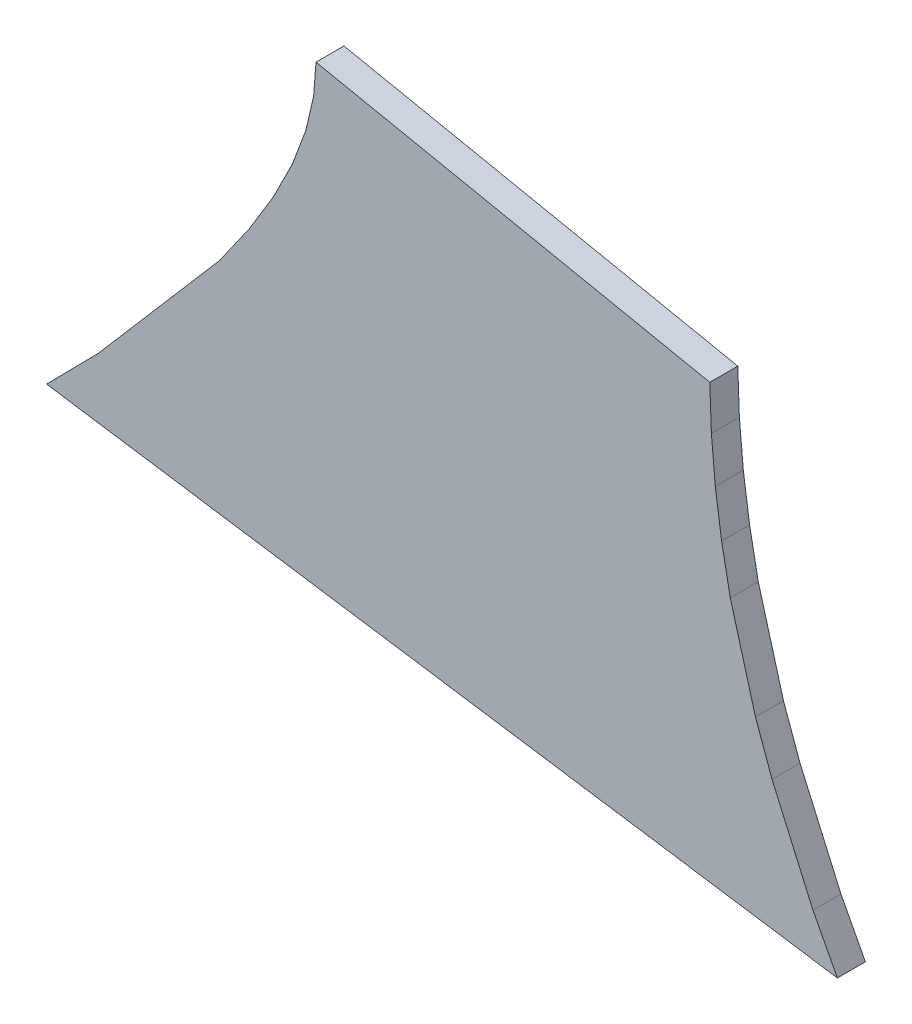
ISO-10303-21;
HEADER;
FILE_DESCRIPTION(('STEP AP214'),'2;1');
FILE_NAME('part.step','',(''),(''),'','','');
FILE_SCHEMA(('AUTOMOTIVE_DESIGN { 1 0 10303 214 1 1 1 1 }'));
ENDSEC;
DATA;
#1=APPLICATION_CONTEXT('core data for automotive mechanical design processes');
#2=APPLICATION_PROTOCOL_DEFINITION('international standard','automotive_design',2000,#1);
#3=PRODUCT_CONTEXT('',#1,'mechanical');
#4=PRODUCT('Part','Part','',(#3));
#5=PRODUCT_RELATED_PRODUCT_CATEGORY('part','',(#4));
#6=PRODUCT_DEFINITION_FORMATION('','',#4);
#7=PRODUCT_DEFINITION_CONTEXT('part definition',#1,'design');
#8=PRODUCT_DEFINITION('design','',#6,#7);
#9=PRODUCT_DEFINITION_SHAPE('','',#8);
#10=(LENGTH_UNIT() NAMED_UNIT(*) SI_UNIT(.MILLI.,.METRE.));
#11=(NAMED_UNIT(*) PLANE_ANGLE_UNIT() SI_UNIT($,.RADIAN.));
#12=(NAMED_UNIT(*) SI_UNIT($,.STERADIAN.) SOLID_ANGLE_UNIT());
#13=UNCERTAINTY_MEASURE_WITH_UNIT(LENGTH_MEASURE(1.E-05),#10,'distance_accuracy_value','');
#14=(GEOMETRIC_REPRESENTATION_CONTEXT(3) GLOBAL_UNCERTAINTY_ASSIGNED_CONTEXT((#13)) GLOBAL_UNIT_ASSIGNED_CONTEXT((#10,
#11,#12)) REPRESENTATION_CONTEXT('',''));
#15=CARTESIAN_POINT('',(0.,0.,0.));
#16=DIRECTION('',(0.,0.,1.));
#17=DIRECTION('',(1.,0.,0.));
#18=AXIS2_PLACEMENT_3D('',#15,#16,#17);
#19=CARTESIAN_POINT('',(87.2969970703125,109.977996826172,0.));
#20=DIRECTION('',(0.997056780120677,-0.0766666629989094,0.));
#21=DIRECTION('',(-0.0766666629989094,-0.997056780120677,0.));
#22=AXIS2_PLACEMENT_3D('',#19,#20,#21);
#23=PLANE('',#22);
#24=DIRECTION('',(-0.0766666629989094,-0.997056780120677,0.));
#25=VECTOR('',#24,1.);
#26=CARTESIAN_POINT('',(87.2969970703125,109.977996826172,0.03556));
#27=LINE('',#26,#25);
#28=CARTESIAN_POINT('',(87.2969970703125,109.977996826172,0.03556));
#29=VERTEX_POINT('',#28);
#30=CARTESIAN_POINT('',(87.2939987182617,109.939002990723,0.03556));
#31=VERTEX_POINT('',#30);
#32=EDGE_CURVE('E11',#29,#31,#27,.T.);
#33=ORIENTED_EDGE('',*,*,#32,.F.);
#34=DIRECTION('',(0.,0.,1.));
#35=VECTOR('',#34,1.);
#36=CARTESIAN_POINT('',(87.2969970703125,109.977996826172,0.));
#37=LINE('',#36,#35);
#38=CARTESIAN_POINT('',(87.2969970703125,109.977996826172,0.));
#39=VERTEX_POINT('',#38);
#40=EDGE_CURVE('E24',#39,#29,#37,.T.);
#41=ORIENTED_EDGE('',*,*,#40,.F.);
#42=DIRECTION('',(-0.0766666629989094,-0.997056780120677,0.));
#43=VECTOR('',#42,1.);
#44=CARTESIAN_POINT('',(87.2969970703125,109.977996826172,0.));
#45=LINE('',#44,#43);
#46=CARTESIAN_POINT('',(87.2939987182617,109.939002990723,0.));
#47=VERTEX_POINT('',#46);
#48=EDGE_CURVE('E160',#39,#47,#45,.T.);
#49=ORIENTED_EDGE('',*,*,#48,.T.);
#50=DIRECTION('',(0.,0.,1.));
#51=VECTOR('',#50,1.);
#52=CARTESIAN_POINT('',(87.2939987182617,109.939002990723,0.));
#53=LINE('',#52,#51);
#54=EDGE_CURVE('E37',#47,#31,#53,.T.);
#55=ORIENTED_EDGE('',*,*,#54,.T.);
#56=EDGE_LOOP('',(#33,#41,#49,#55));
#57=FACE_BOUND('',#56,.T.);
#58=ADVANCED_FACE('F17',(#57),#23,.F.);
#59=CARTESIAN_POINT('',(87.2939987182617,109.939002990723,0.));
#60=DIRECTION('',(0.97399649873471,-0.226563060653159,0.));
#61=DIRECTION('',(-0.226563060653159,-0.97399649873471,0.));
#62=AXIS2_PLACEMENT_3D('',#59,#60,#61);
#63=PLANE('',#62);
#64=DIRECTION('',(-0.226563060653159,-0.97399649873471,0.));
#65=VECTOR('',#64,1.);
#66=CARTESIAN_POINT('',(87.2939987182617,109.939002990723,0.03556));
#67=LINE('',#66,#65);
#68=CARTESIAN_POINT('',(87.2839965820313,109.896003723144,0.03556));
#69=VERTEX_POINT('',#68);
#70=EDGE_CURVE('E280',#31,#69,#67,.T.);
#71=ORIENTED_EDGE('',*,*,#70,.F.);
#72=ORIENTED_EDGE('',*,*,#54,.F.);
#73=DIRECTION('',(-0.226563060653159,-0.97399649873471,0.));
#74=VECTOR('',#73,1.);
#75=CARTESIAN_POINT('',(87.2939987182617,109.939002990723,0.));
#76=LINE('',#75,#74);
#77=CARTESIAN_POINT('',(87.2839965820313,109.896003723144,0.));
#78=VERTEX_POINT('',#77);
#79=EDGE_CURVE('E277',#47,#78,#76,.T.);
#80=ORIENTED_EDGE('',*,*,#79,.T.);
#81=DIRECTION('',(0.,0.,1.));
#82=VECTOR('',#81,1.);
#83=CARTESIAN_POINT('',(87.2839965820313,109.896003723144,0.));
#84=LINE('',#83,#82);
#85=EDGE_CURVE('E275',#78,#69,#84,.T.);
#86=ORIENTED_EDGE('',*,*,#85,.T.);
#87=EDGE_LOOP('',(#71,#72,#80,#86));
#88=FACE_BOUND('',#87,.T.);
#89=ADVANCED_FACE('F288',(#88),#63,.F.);
#90=CARTESIAN_POINT('',(87.2839965820313,109.896003723144,0.));
#91=DIRECTION('',(0.935498887490532,-0.353329635756722,0.));
#92=DIRECTION('',(-0.353329635756722,-0.935498887490532,0.));
#93=AXIS2_PLACEMENT_3D('',#90,#91,#92);
#94=PLANE('',#93);
#95=DIRECTION('',(-0.353329635756722,-0.935498887490532,0.));
#96=VECTOR('',#95,1.);
#97=CARTESIAN_POINT('',(87.2839965820313,109.896003723144,0.03556));
#98=LINE('',#97,#96);
#99=CARTESIAN_POINT('',(87.2669982910156,109.850997924805,0.03556));
#100=VERTEX_POINT('',#99);
#101=EDGE_CURVE('E272',#69,#100,#98,.T.);
#102=ORIENTED_EDGE('',*,*,#101,.F.);
#103=ORIENTED_EDGE('',*,*,#85,.F.);
#104=DIRECTION('',(-0.353329635756722,-0.935498887490532,0.));
#105=VECTOR('',#104,1.);
#106=CARTESIAN_POINT('',(87.2839965820313,109.896003723144,0.));
#107=LINE('',#106,#105);
#108=CARTESIAN_POINT('',(87.2669982910156,109.850997924805,0.));
#109=VERTEX_POINT('',#108);
#110=EDGE_CURVE('E269',#78,#109,#107,.T.);
#111=ORIENTED_EDGE('',*,*,#110,.T.);
#112=DIRECTION('',(0.,0.,1.));
#113=VECTOR('',#112,1.);
#114=CARTESIAN_POINT('',(87.2669982910156,109.850997924805,0.));
#115=LINE('',#114,#113);
#116=EDGE_CURVE('E267',#109,#100,#115,.T.);
#117=ORIENTED_EDGE('',*,*,#116,.T.);
#118=EDGE_LOOP('',(#102,#103,#111,#117));
#119=FACE_BOUND('',#118,.T.);
#120=ADVANCED_FACE('F294',(#119),#94,.F.);
#121=CARTESIAN_POINT('',(87.2669982910156,109.850997924805,0.));
#122=DIRECTION('',(0.894398754960443,-0.44727046305922,0.));
#123=DIRECTION('',(-0.44727046305922,-0.894398754960443,0.));
#124=AXIS2_PLACEMENT_3D('',#121,#122,#123);
#125=PLANE('',#124);
#126=DIRECTION('',(-0.44727046305922,-0.894398754960443,0.));
#127=VECTOR('',#126,1.);
#128=CARTESIAN_POINT('',(87.2669982910156,109.850997924805,0.03556));
#129=LINE('',#128,#127);
#130=CARTESIAN_POINT('',(87.2429962158203,109.803001403809,0.03556));
#131=VERTEX_POINT('',#130);
#132=EDGE_CURVE('E264',#100,#131,#129,.T.);
#133=ORIENTED_EDGE('',*,*,#132,.F.);
#134=ORIENTED_EDGE('',*,*,#116,.F.);
#135=DIRECTION('',(-0.44727046305922,-0.894398754960443,0.));
#136=VECTOR('',#135,1.);
#137=CARTESIAN_POINT('',(87.2669982910156,109.850997924805,0.));
#138=LINE('',#137,#136);
#139=CARTESIAN_POINT('',(87.2429962158203,109.803001403809,0.));
#140=VERTEX_POINT('',#139);
#141=EDGE_CURVE('E261',#109,#140,#138,.T.);
#142=ORIENTED_EDGE('',*,*,#141,.T.);
#143=DIRECTION('',(0.,0.,1.));
#144=VECTOR('',#143,1.);
#145=CARTESIAN_POINT('',(87.2429962158203,109.803001403809,0.));
#146=LINE('',#145,#144);
#147=EDGE_CURVE('E259',#140,#131,#146,.T.);
#148=ORIENTED_EDGE('',*,*,#147,.T.);
#149=EDGE_LOOP('',(#133,#134,#142,#148));
#150=FACE_BOUND('',#149,.T.);
#151=ADVANCED_FACE('F296',(#150),#125,.F.);
#152=CARTESIAN_POINT('',(87.2429962158203,109.803001403809,0.));
#153=DIRECTION('',(0.854546415635616,-0.519375031672028,0.));
#154=DIRECTION('',(-0.519375031672028,-0.854546415635616,0.));
#155=AXIS2_PLACEMENT_3D('',#152,#153,#154);
#156=PLANE('',#155);
#157=DIRECTION('',(-0.519375031672028,-0.854546415635616,0.));
#158=VECTOR('',#157,1.);
#159=CARTESIAN_POINT('',(87.2429962158203,109.803001403809,0.03556));
#160=LINE('',#159,#158);
#161=CARTESIAN_POINT('',(87.2119979858398,109.751998901367,0.03556));
#162=VERTEX_POINT('',#161);
#163=EDGE_CURVE('E256',#131,#162,#160,.T.);
#164=ORIENTED_EDGE('',*,*,#163,.F.);
#165=ORIENTED_EDGE('',*,*,#147,.F.);
#166=DIRECTION('',(-0.519375031672028,-0.854546415635616,0.));
#167=VECTOR('',#166,1.);
#168=CARTESIAN_POINT('',(87.2429962158203,109.803001403809,0.));
#169=LINE('',#168,#167);
#170=CARTESIAN_POINT('',(87.2119979858398,109.751998901367,0.));
#171=VERTEX_POINT('',#170);
#172=EDGE_CURVE('E253',#140,#171,#169,.T.);
#173=ORIENTED_EDGE('',*,*,#172,.T.);
#174=DIRECTION('',(0.,0.,1.));
#175=VECTOR('',#174,1.);
#176=CARTESIAN_POINT('',(87.2119979858398,109.751998901367,0.));
#177=LINE('',#176,#175);
#178=EDGE_CURVE('E251',#171,#162,#177,.T.);
#179=ORIENTED_EDGE('',*,*,#178,.T.);
#180=EDGE_LOOP('',(#164,#165,#173,#179));
#181=FACE_BOUND('',#180,.T.);
#182=ADVANCED_FACE('F301',(#181),#156,.F.);
#183=CARTESIAN_POINT('',(87.2119979858398,109.751998901367,0.));
#184=DIRECTION('',(0.817850728051964,-0.575430435956313,0.));
#185=DIRECTION('',(-0.575430435956313,-0.817850728051964,0.));
#186=AXIS2_PLACEMENT_3D('',#183,#184,#185);
#187=PLANE('',#186);
#188=DIRECTION('',(-0.575430435956313,-0.817850728051964,0.));
#189=VECTOR('',#188,1.);
#190=CARTESIAN_POINT('',(87.2119979858398,109.751998901367,0.03556));
#191=LINE('',#190,#189);
#192=CARTESIAN_POINT('',(87.1740036010742,109.697998046875,0.03556));
#193=VERTEX_POINT('',#192);
#194=EDGE_CURVE('E248',#162,#193,#191,.T.);
#195=ORIENTED_EDGE('',*,*,#194,.F.);
#196=ORIENTED_EDGE('',*,*,#178,.F.);
#197=DIRECTION('',(-0.575430435956313,-0.817850728051964,0.));
#198=VECTOR('',#197,1.);
#199=CARTESIAN_POINT('',(87.2119979858398,109.751998901367,0.));
#200=LINE('',#199,#198);
#201=CARTESIAN_POINT('',(87.1740036010742,109.697998046875,0.));
#202=VERTEX_POINT('',#201);
#203=EDGE_CURVE('E245',#171,#202,#200,.T.);
#204=ORIENTED_EDGE('',*,*,#203,.T.);
#205=DIRECTION('',(0.,0.,1.));
#206=VECTOR('',#205,1.);
#207=CARTESIAN_POINT('',(87.1740036010742,109.697998046875,0.));
#208=LINE('',#207,#206);
#209=EDGE_CURVE('E243',#202,#193,#208,.T.);
#210=ORIENTED_EDGE('',*,*,#209,.T.);
#211=EDGE_LOOP('',(#195,#196,#204,#210));
#212=FACE_BOUND('',#211,.T.);
#213=ADVANCED_FACE('F304',(#212),#187,.F.);
#214=CARTESIAN_POINT('',(87.1740036010742,109.697998046875,0.));
#215=DIRECTION('',(0.758046535640033,-0.652200467497643,0.));
#216=DIRECTION('',(-0.652200467497643,-0.758046535640033,0.));
#217=AXIS2_PLACEMENT_3D('',#214,#215,#216);
#218=PLANE('',#217);
#219=DIRECTION('',(-0.652200467497643,-0.758046535640033,0.));
#220=VECTOR('',#219,1.);
#221=CARTESIAN_POINT('',(87.1740036010742,109.697998046875,0.03556));
#222=LINE('',#221,#220);
#223=CARTESIAN_POINT('',(87.0199966430664,109.518997192383,0.03556));
#224=VERTEX_POINT('',#223);
#225=EDGE_CURVE('E240',#193,#224,#222,.T.);
#226=ORIENTED_EDGE('',*,*,#225,.F.);
#227=ORIENTED_EDGE('',*,*,#209,.F.);
#228=DIRECTION('',(-0.652200467497643,-0.758046535640033,0.));
#229=VECTOR('',#228,1.);
#230=CARTESIAN_POINT('',(87.1740036010742,109.697998046875,0.));
#231=LINE('',#230,#229);
#232=CARTESIAN_POINT('',(87.0199966430664,109.518997192383,0.));
#233=VERTEX_POINT('',#232);
#234=EDGE_CURVE('E237',#202,#233,#231,.T.);
#235=ORIENTED_EDGE('',*,*,#234,.T.);
#236=DIRECTION('',(0.,0.,1.));
#237=VECTOR('',#236,1.);
#238=CARTESIAN_POINT('',(87.0199966430664,109.518997192383,0.));
#239=LINE('',#238,#237);
#240=EDGE_CURVE('E235',#233,#224,#239,.T.);
#241=ORIENTED_EDGE('',*,*,#240,.T.);
#242=EDGE_LOOP('',(#226,#227,#235,#241));
#243=FACE_BOUND('',#242,.T.);
#244=ADVANCED_FACE('F309',(#243),#218,.F.);
#245=CARTESIAN_POINT('',(87.0199966430664,109.518997192383,0.));
#246=DIRECTION('',(0.712481288663156,-0.701691109609413,0.));
#247=DIRECTION('',(-0.701691109609413,-0.712481288663156,0.));
#248=AXIS2_PLACEMENT_3D('',#245,#246,#247);
#249=PLANE('',#248);
#250=DIRECTION('',(-0.701691109609413,-0.712481288663156,0.));
#251=VECTOR('',#250,1.);
#252=CARTESIAN_POINT('',(87.0199966430664,109.518997192383,0.03556));
#253=LINE('',#252,#251);
#254=CARTESIAN_POINT('',(86.9550018310547,109.453002929688,0.03556));
#255=VERTEX_POINT('',#254);
#256=EDGE_CURVE('E232',#224,#255,#253,.T.);
#257=ORIENTED_EDGE('',*,*,#256,.F.);
#258=ORIENTED_EDGE('',*,*,#240,.F.);
#259=DIRECTION('',(-0.701691109609413,-0.712481288663156,0.));
#260=VECTOR('',#259,1.);
#261=CARTESIAN_POINT('',(87.0199966430664,109.518997192383,0.));
#262=LINE('',#261,#260);
#263=CARTESIAN_POINT('',(86.9550018310547,109.453002929688,0.));
#264=VERTEX_POINT('',#263);
#265=EDGE_CURVE('E229',#233,#264,#262,.T.);
#266=ORIENTED_EDGE('',*,*,#265,.T.);
#267=DIRECTION('',(0.,0.,1.));
#268=VECTOR('',#267,1.);
#269=CARTESIAN_POINT('',(86.9550018310547,109.453002929688,0.));
#270=LINE('',#269,#268);
#271=EDGE_CURVE('E227',#264,#255,#270,.T.);
#272=ORIENTED_EDGE('',*,*,#271,.T.);
#273=EDGE_LOOP('',(#257,#258,#266,#272));
#274=FACE_BOUND('',#273,.T.);
#275=ADVANCED_FACE('F312',(#274),#249,.F.);
#276=CARTESIAN_POINT('',(86.9550018310547,109.453002929688,0.));
#277=DIRECTION('',(0.148727006644052,0.98887829255915,0.));
#278=DIRECTION('',(0.98887829255915,-0.148727006644052,0.));
#279=AXIS2_PLACEMENT_3D('',#276,#277,#278);
#280=PLANE('',#279);
#281=DIRECTION('',(0.98887829255915,-0.148727006644052,0.));
#282=VECTOR('',#281,1.);
#283=CARTESIAN_POINT('',(86.9550018310547,109.453002929688,0.03556));
#284=LINE('',#283,#282);
#285=CARTESIAN_POINT('',(87.9589996337891,109.302001953125,0.03556));
#286=VERTEX_POINT('',#285);
#287=EDGE_CURVE('E224',#255,#286,#284,.T.);
#288=ORIENTED_EDGE('',*,*,#287,.F.);
#289=ORIENTED_EDGE('',*,*,#271,.F.);
#290=DIRECTION('',(0.98887829255915,-0.148727006644052,0.));
#291=VECTOR('',#290,1.);
#292=CARTESIAN_POINT('',(86.9550018310547,109.453002929688,0.));
#293=LINE('',#292,#291);
#294=CARTESIAN_POINT('',(87.9589996337891,109.302001953125,0.));
#295=VERTEX_POINT('',#294);
#296=EDGE_CURVE('E221',#264,#295,#293,.T.);
#297=ORIENTED_EDGE('',*,*,#296,.T.);
#298=DIRECTION('',(0.,0.,1.));
#299=VECTOR('',#298,1.);
#300=CARTESIAN_POINT('',(87.9589996337891,109.302001953125,0.));
#301=LINE('',#300,#299);
#302=EDGE_CURVE('E219',#295,#286,#301,.T.);
#303=ORIENTED_EDGE('',*,*,#302,.T.);
#304=EDGE_LOOP('',(#288,#289,#297,#303));
#305=FACE_BOUND('',#304,.T.);
#306=ADVANCED_FACE('F317',(#305),#280,.F.);
#307=CARTESIAN_POINT('',(87.9589996337891,109.302001953125,0.));
#308=DIRECTION('',(-0.885248268877242,-0.465118804661611,0.));
#309=DIRECTION('',(-0.465118804661611,0.885248268877242,0.));
#310=AXIS2_PLACEMENT_3D('',#307,#308,#309);
#311=PLANE('',#310);
#312=DIRECTION('',(-0.465118804661611,0.885248268877242,0.));
#313=VECTOR('',#312,1.);
#314=CARTESIAN_POINT('',(87.9589996337891,109.302001953125,0.03556));
#315=LINE('',#314,#313);
#316=CARTESIAN_POINT('',(87.9280014038086,109.361000061035,0.03556));
#317=VERTEX_POINT('',#316);
#318=EDGE_CURVE('E216',#286,#317,#315,.T.);
#319=ORIENTED_EDGE('',*,*,#318,.F.);
#320=ORIENTED_EDGE('',*,*,#302,.F.);
#321=DIRECTION('',(-0.465118804661611,0.885248268877242,0.));
#322=VECTOR('',#321,1.);
#323=CARTESIAN_POINT('',(87.9589996337891,109.302001953125,0.));
#324=LINE('',#323,#322);
#325=CARTESIAN_POINT('',(87.9280014038086,109.361000061035,0.));
#326=VERTEX_POINT('',#325);
#327=EDGE_CURVE('E213',#295,#326,#324,.T.);
#328=ORIENTED_EDGE('',*,*,#327,.T.);
#329=DIRECTION('',(0.,0.,1.));
#330=VECTOR('',#329,1.);
#331=CARTESIAN_POINT('',(87.9280014038086,109.361000061035,0.));
#332=LINE('',#331,#330);
#333=EDGE_CURVE('E211',#326,#317,#332,.T.);
#334=ORIENTED_EDGE('',*,*,#333,.T.);
#335=EDGE_LOOP('',(#319,#320,#328,#334));
#336=FACE_BOUND('',#335,.T.);
#337=ADVANCED_FACE('F320',(#336),#311,.F.);
#338=CARTESIAN_POINT('',(87.9280014038086,109.361000061035,0.));
#339=DIRECTION('',(-0.915075824077826,-0.403281832207065,0.));
#340=DIRECTION('',(-0.403281832207065,0.915075824077826,0.));
#341=AXIS2_PLACEMENT_3D('',#338,#339,#340);
#342=PLANE('',#341);
#343=DIRECTION('',(-0.403281832207065,0.915075824077826,0.));
#344=VECTOR('',#343,1.);
#345=CARTESIAN_POINT('',(87.9280014038086,109.361000061035,0.03556));
#346=LINE('',#345,#344);
#347=CARTESIAN_POINT('',(87.8759994506836,109.478996276855,0.03556));
#348=VERTEX_POINT('',#347);
#349=EDGE_CURVE('E208',#317,#348,#346,.T.);
#350=ORIENTED_EDGE('',*,*,#349,.F.);
#351=ORIENTED_EDGE('',*,*,#333,.F.);
#352=DIRECTION('',(-0.403281832207065,0.915075824077826,0.));
#353=VECTOR('',#352,1.);
#354=CARTESIAN_POINT('',(87.9280014038086,109.361000061035,0.));
#355=LINE('',#354,#353);
#356=CARTESIAN_POINT('',(87.8759994506836,109.478996276855,0.));
#357=VERTEX_POINT('',#356);
#358=EDGE_CURVE('E205',#326,#357,#355,.T.);
#359=ORIENTED_EDGE('',*,*,#358,.T.);
#360=DIRECTION('',(0.,0.,1.));
#361=VECTOR('',#360,1.);
#362=CARTESIAN_POINT('',(87.8759994506836,109.478996276855,0.));
#363=LINE('',#362,#361);
#364=EDGE_CURVE('E203',#357,#348,#363,.T.);
#365=ORIENTED_EDGE('',*,*,#364,.T.);
#366=EDGE_LOOP('',(#350,#351,#359,#365));
#367=FACE_BOUND('',#366,.T.);
#368=ADVANCED_FACE('F325',(#367),#342,.F.);
#369=CARTESIAN_POINT('',(87.8759994506836,109.478996276855,0.));
#370=DIRECTION('',(-0.940297926418306,-0.340352478429985,0.));
#371=DIRECTION('',(-0.340352478429985,0.940297926418306,0.));
#372=AXIS2_PLACEMENT_3D('',#369,#370,#371);
#373=PLANE('',#372);
#374=DIRECTION('',(-0.340352478429985,0.940297926418306,0.));
#375=VECTOR('',#374,1.);
#376=CARTESIAN_POINT('',(87.8759994506836,109.478996276855,0.03556));
#377=LINE('',#376,#375);
#378=CARTESIAN_POINT('',(87.8550033569336,109.537002563477,0.03556));
#379=VERTEX_POINT('',#378);
#380=EDGE_CURVE('E200',#348,#379,#377,.T.);
#381=ORIENTED_EDGE('',*,*,#380,.F.);
#382=ORIENTED_EDGE('',*,*,#364,.F.);
#383=DIRECTION('',(-0.340352478429985,0.940297926418306,0.));
#384=VECTOR('',#383,1.);
#385=CARTESIAN_POINT('',(87.8759994506836,109.478996276855,0.));
#386=LINE('',#385,#384);
#387=CARTESIAN_POINT('',(87.8550033569336,109.537002563477,0.));
#388=VERTEX_POINT('',#387);
#389=EDGE_CURVE('E197',#357,#388,#386,.T.);
#390=ORIENTED_EDGE('',*,*,#389,.T.);
#391=DIRECTION('',(0.,0.,1.));
#392=VECTOR('',#391,1.);
#393=CARTESIAN_POINT('',(87.8550033569336,109.537002563477,0.));
#394=LINE('',#393,#392);
#395=EDGE_CURVE('E195',#388,#379,#394,.T.);
#396=ORIENTED_EDGE('',*,*,#395,.T.);
#397=EDGE_LOOP('',(#381,#382,#390,#396));
#398=FACE_BOUND('',#397,.T.);
#399=ADVANCED_FACE('F328',(#398),#373,.F.);
#400=CARTESIAN_POINT('',(87.8550033569336,109.537002563477,0.));
#401=DIRECTION('',(-0.963385017152072,-0.268121816954351,0.));
#402=DIRECTION('',(-0.268121816954351,0.963385017152072,0.));
#403=AXIS2_PLACEMENT_3D('',#400,#401,#402);
#404=PLANE('',#403);
#405=DIRECTION('',(-0.268121816954351,0.963385017152072,0.));
#406=VECTOR('',#405,1.);
#407=CARTESIAN_POINT('',(87.8550033569336,109.537002563477,0.03556));
#408=LINE('',#407,#406);
#409=CARTESIAN_POINT('',(87.822998046875,109.652000427246,0.03556));
#410=VERTEX_POINT('',#409);
#411=EDGE_CURVE('E192',#379,#410,#408,.T.);
#412=ORIENTED_EDGE('',*,*,#411,.F.);
#413=ORIENTED_EDGE('',*,*,#395,.F.);
#414=DIRECTION('',(-0.268121816954351,0.963385017152072,0.));
#415=VECTOR('',#414,1.);
#416=CARTESIAN_POINT('',(87.8550033569336,109.537002563477,0.));
#417=LINE('',#416,#415);
#418=CARTESIAN_POINT('',(87.822998046875,109.652000427246,0.));
#419=VERTEX_POINT('',#418);
#420=EDGE_CURVE('E189',#388,#419,#417,.T.);
#421=ORIENTED_EDGE('',*,*,#420,.T.);
#422=DIRECTION('',(0.,0.,1.));
#423=VECTOR('',#422,1.);
#424=CARTESIAN_POINT('',(87.822998046875,109.652000427246,0.));
#425=LINE('',#424,#423);
#426=EDGE_CURVE('E187',#419,#410,#425,.T.);
#427=ORIENTED_EDGE('',*,*,#426,.T.);
#428=EDGE_LOOP('',(#412,#413,#421,#427));
#429=FACE_BOUND('',#428,.T.);
#430=ADVANCED_FACE('F333',(#429),#404,.F.);
#431=CARTESIAN_POINT('',(87.822998046875,109.652000427246,0.));
#432=DIRECTION('',(-0.981877794410834,-0.189515162567317,0.));
#433=DIRECTION('',(-0.189515162567317,0.981877794410834,0.));
#434=AXIS2_PLACEMENT_3D('',#431,#432,#433);
#435=PLANE('',#434);
#436=DIRECTION('',(-0.189515162567317,0.981877794410834,0.));
#437=VECTOR('',#436,1.);
#438=CARTESIAN_POINT('',(87.822998046875,109.652000427246,0.03556));
#439=LINE('',#438,#437);
#440=CARTESIAN_POINT('',(87.8119964599609,109.708999633789,0.03556));
#441=VERTEX_POINT('',#440);
#442=EDGE_CURVE('E184',#410,#441,#439,.T.);
#443=ORIENTED_EDGE('',*,*,#442,.F.);
#444=ORIENTED_EDGE('',*,*,#426,.F.);
#445=DIRECTION('',(-0.189515162567317,0.981877794410834,0.));
#446=VECTOR('',#445,1.);
#447=CARTESIAN_POINT('',(87.822998046875,109.652000427246,0.));
#448=LINE('',#447,#446);
#449=CARTESIAN_POINT('',(87.8119964599609,109.708999633789,0.));
#450=VERTEX_POINT('',#449);
#451=EDGE_CURVE('E181',#419,#450,#448,.T.);
#452=ORIENTED_EDGE('',*,*,#451,.T.);
#453=DIRECTION('',(0.,0.,1.));
#454=VECTOR('',#453,1.);
#455=CARTESIAN_POINT('',(87.8119964599609,109.708999633789,0.));
#456=LINE('',#455,#454);
#457=EDGE_CURVE('E179',#450,#441,#456,.T.);
#458=ORIENTED_EDGE('',*,*,#457,.T.);
#459=EDGE_LOOP('',(#443,#444,#452,#458));
#460=FACE_BOUND('',#459,.T.);
#461=ADVANCED_FACE('F336',(#460),#435,.F.);
#462=CARTESIAN_POINT('',(87.8119964599609,109.708999633789,0.));
#463=DIRECTION('',(-0.989960280537772,-0.141345827520925,0.));
#464=DIRECTION('',(-0.141345827520925,0.989960280537772,0.));
#465=AXIS2_PLACEMENT_3D('',#462,#463,#464);
#466=PLANE('',#465);
#467=DIRECTION('',(-0.141345827520925,0.989960280537772,0.));
#468=VECTOR('',#467,1.);
#469=CARTESIAN_POINT('',(87.8119964599609,109.708999633789,0.03556));
#470=LINE('',#469,#468);
#471=CARTESIAN_POINT('',(87.8040008544922,109.764999389648,0.03556));
#472=VERTEX_POINT('',#471);
#473=EDGE_CURVE('E176',#441,#472,#470,.T.);
#474=ORIENTED_EDGE('',*,*,#473,.F.);
#475=ORIENTED_EDGE('',*,*,#457,.F.);
#476=DIRECTION('',(-0.141345827520925,0.989960280537772,0.));
#477=VECTOR('',#476,1.);
#478=CARTESIAN_POINT('',(87.8119964599609,109.708999633789,0.));
#479=LINE('',#478,#477);
#480=CARTESIAN_POINT('',(87.8040008544922,109.764999389648,0.));
#481=VERTEX_POINT('',#480);
#482=EDGE_CURVE('E173',#450,#481,#479,.T.);
#483=ORIENTED_EDGE('',*,*,#482,.T.);
#484=DIRECTION('',(0.,0.,1.));
#485=VECTOR('',#484,1.);
#486=CARTESIAN_POINT('',(87.8040008544922,109.764999389648,0.));
#487=LINE('',#486,#485);
#488=EDGE_CURVE('E171',#481,#472,#487,.T.);
#489=ORIENTED_EDGE('',*,*,#488,.T.);
#490=EDGE_LOOP('',(#474,#475,#483,#489));
#491=FACE_BOUND('',#490,.T.);
#492=ADVANCED_FACE('F341',(#491),#466,.F.);
#493=CARTESIAN_POINT('',(87.8040008544922,109.764999389648,0.));
#494=DIRECTION('',(-0.996041997116462,-0.0888838566909104,0.));
#495=DIRECTION('',(-0.0888838566909104,0.996041997116462,0.));
#496=AXIS2_PLACEMENT_3D('',#493,#494,#495);
#497=PLANE('',#496);
#498=DIRECTION('',(-0.0888838566909104,0.996041997116462,0.));
#499=VECTOR('',#498,1.);
#500=CARTESIAN_POINT('',(87.8040008544922,109.764999389648,0.03556));
#501=LINE('',#500,#499);
#502=CARTESIAN_POINT('',(87.7990036010742,109.820999145508,0.03556));
#503=VERTEX_POINT('',#502);
#504=EDGE_CURVE('E168',#472,#503,#501,.T.);
#505=ORIENTED_EDGE('',*,*,#504,.F.);
#506=ORIENTED_EDGE('',*,*,#488,.F.);
#507=DIRECTION('',(-0.0888838566909104,0.996041997116462,0.));
#508=VECTOR('',#507,1.);
#509=CARTESIAN_POINT('',(87.8040008544922,109.764999389648,0.));
#510=LINE('',#509,#508);
#511=CARTESIAN_POINT('',(87.7990036010742,109.820999145508,0.));
#512=VERTEX_POINT('',#511);
#513=EDGE_CURVE('E166',#481,#512,#510,.T.);
#514=ORIENTED_EDGE('',*,*,#513,.T.);
#515=DIRECTION('',(0.,0.,1.));
#516=VECTOR('',#515,1.);
#517=CARTESIAN_POINT('',(87.7990036010742,109.820999145508,0.));
#518=LINE('',#517,#516);
#519=EDGE_CURVE('E151',#512,#503,#518,.T.);
#520=ORIENTED_EDGE('',*,*,#519,.T.);
#521=EDGE_LOOP('',(#505,#506,#514,#520));
#522=FACE_BOUND('',#521,.T.);
#523=ADVANCED_FACE('F343',(#522),#497,.F.);
#524=CARTESIAN_POINT('',(87.7990036010742,109.820999145508,0.));
#525=DIRECTION('',(-0.999335189000129,-0.0364579213076757,0.));
#526=DIRECTION('',(-0.0364579213076757,0.999335189000129,0.));
#527=AXIS2_PLACEMENT_3D('',#524,#525,#526);
#528=PLANE('',#527);
#529=DIRECTION('',(-0.0364579213076757,0.999335189000129,0.));
#530=VECTOR('',#529,1.);
#531=CARTESIAN_POINT('',(87.7990036010742,109.820999145508,0.03556));
#532=LINE('',#531,#530);
#533=CARTESIAN_POINT('',(87.7969970703125,109.875999450684,0.03556));
#534=VERTEX_POINT('',#533);
#535=EDGE_CURVE('E155',#503,#534,#532,.T.);
#536=ORIENTED_EDGE('',*,*,#535,.F.);
#537=ORIENTED_EDGE('',*,*,#519,.F.);
#538=DIRECTION('',(-0.0364579213076757,0.999335189000129,0.));
#539=VECTOR('',#538,1.);
#540=CARTESIAN_POINT('',(87.7990036010742,109.820999145508,0.));
#541=LINE('',#540,#539);
#542=CARTESIAN_POINT('',(87.7969970703125,109.875999450684,0.));
#543=VERTEX_POINT('',#542);
#544=EDGE_CURVE('E147',#512,#543,#541,.T.);
#545=ORIENTED_EDGE('',*,*,#544,.T.);
#546=DIRECTION('',(0.,0.,1.));
#547=VECTOR('',#546,1.);
#548=CARTESIAN_POINT('',(87.7969970703125,109.875999450684,0.));
#549=LINE('',#548,#547);
#550=EDGE_CURVE('E137',#543,#534,#549,.T.);
#551=ORIENTED_EDGE('',*,*,#550,.T.);
#552=EDGE_LOOP('',(#536,#537,#545,#551));
#553=FACE_BOUND('',#552,.T.);
#554=ADVANCED_FACE('F150',(#553),#528,.F.);
#555=CARTESIAN_POINT('',(87.7969970703125,109.875999450684,0.));
#556=DIRECTION('',(-0.199878286609613,-0.979820733880441,0.));
#557=DIRECTION('',(-0.979820733880441,0.199878286609613,0.));
#558=AXIS2_PLACEMENT_3D('',#555,#556,#557);
#559=PLANE('',#558);
#560=DIRECTION('',(-0.979820733880441,0.199878286609613,0.));
#561=VECTOR('',#560,1.);
#562=CARTESIAN_POINT('',(87.7969970703125,109.875999450684,0.03556));
#563=LINE('',#562,#561);
#564=EDGE_CURVE('E143',#534,#29,#563,.T.);
#565=ORIENTED_EDGE('',*,*,#564,.F.);
#566=ORIENTED_EDGE('',*,*,#550,.F.);
#567=DIRECTION('',(-0.979820733880441,0.199878286609613,0.));
#568=VECTOR('',#567,1.);
#569=CARTESIAN_POINT('',(87.7969970703125,109.875999450684,0.));
#570=LINE('',#569,#568);
#571=EDGE_CURVE('E141',#543,#39,#570,.T.);
#572=ORIENTED_EDGE('',*,*,#571,.T.);
#573=ORIENTED_EDGE('',*,*,#40,.T.);
#574=EDGE_LOOP('',(#565,#566,#572,#573));
#575=FACE_BOUND('',#574,.T.);
#576=ADVANCED_FACE('F139',(#575),#559,.F.);
#577=CARTESIAN_POINT('',(87.2969970703125,109.977996826172,0.));
#578=DIRECTION('',(0.,0.,1.));
#579=DIRECTION('',(1.,0.,0.));
#580=AXIS2_PLACEMENT_3D('',#577,#578,#579);
#581=PLANE('',#580);
#582=ORIENTED_EDGE('',*,*,#571,.F.);
#583=ORIENTED_EDGE('',*,*,#544,.F.);
#584=ORIENTED_EDGE('',*,*,#513,.F.);
#585=ORIENTED_EDGE('',*,*,#482,.F.);
#586=ORIENTED_EDGE('',*,*,#451,.F.);
#587=ORIENTED_EDGE('',*,*,#420,.F.);
#588=ORIENTED_EDGE('',*,*,#389,.F.);
#589=ORIENTED_EDGE('',*,*,#358,.F.);
#590=ORIENTED_EDGE('',*,*,#327,.F.);
#591=ORIENTED_EDGE('',*,*,#296,.F.);
#592=ORIENTED_EDGE('',*,*,#265,.F.);
#593=ORIENTED_EDGE('',*,*,#234,.F.);
#594=ORIENTED_EDGE('',*,*,#203,.F.);
#595=ORIENTED_EDGE('',*,*,#172,.F.);
#596=ORIENTED_EDGE('',*,*,#141,.F.);
#597=ORIENTED_EDGE('',*,*,#110,.F.);
#598=ORIENTED_EDGE('',*,*,#79,.F.);
#599=ORIENTED_EDGE('',*,*,#48,.F.);
#600=EDGE_LOOP('',(#582,#583,#584,#585,#586,#587,#588,#589,#590,#591,#592,#593,#594,#595,#596,
#597,#598,#599));
#601=FACE_BOUND('',#600,.T.);
#602=ADVANCED_FACE('F158',(#601),#581,.F.);
#603=CARTESIAN_POINT('',(87.2969970703125,109.977996826172,0.03556));
#604=DIRECTION('',(0.,0.,1.));
#605=DIRECTION('',(1.,0.,0.));
#606=AXIS2_PLACEMENT_3D('',#603,#604,#605);
#607=PLANE('',#606);
#608=ORIENTED_EDGE('',*,*,#32,.T.);
#609=ORIENTED_EDGE('',*,*,#70,.T.);
#610=ORIENTED_EDGE('',*,*,#101,.T.);
#611=ORIENTED_EDGE('',*,*,#132,.T.);
#612=ORIENTED_EDGE('',*,*,#163,.T.);
#613=ORIENTED_EDGE('',*,*,#194,.T.);
#614=ORIENTED_EDGE('',*,*,#225,.T.);
#615=ORIENTED_EDGE('',*,*,#256,.T.);
#616=ORIENTED_EDGE('',*,*,#287,.T.);
#617=ORIENTED_EDGE('',*,*,#318,.T.);
#618=ORIENTED_EDGE('',*,*,#349,.T.);
#619=ORIENTED_EDGE('',*,*,#380,.T.);
#620=ORIENTED_EDGE('',*,*,#411,.T.);
#621=ORIENTED_EDGE('',*,*,#442,.T.);
#622=ORIENTED_EDGE('',*,*,#473,.T.);
#623=ORIENTED_EDGE('',*,*,#504,.T.);
#624=ORIENTED_EDGE('',*,*,#535,.T.);
#625=ORIENTED_EDGE('',*,*,#564,.T.);
#626=EDGE_LOOP('',(#608,#609,#610,#611,#612,#613,#614,#615,#616,#617,#618,#619,#620,#621,#622,
#623,#624,#625));
#627=FACE_BOUND('',#626,.T.);
#628=ADVANCED_FACE('F291',(#627),#607,.T.);
#629=CLOSED_SHELL('',(#58,#89,#120,#151,#182,#213,#244,#275,#306,#337,#368,#399,#430,#461,#492,
#523,#554,#576,#602,#628));
#630=MANIFOLD_SOLID_BREP('B1',#629);
#631=ADVANCED_BREP_SHAPE_REPRESENTATION('',(#18,#630),#14);
#632=SHAPE_DEFINITION_REPRESENTATION(#9,#631);
ENDSEC;
END-ISO-10303-21;
